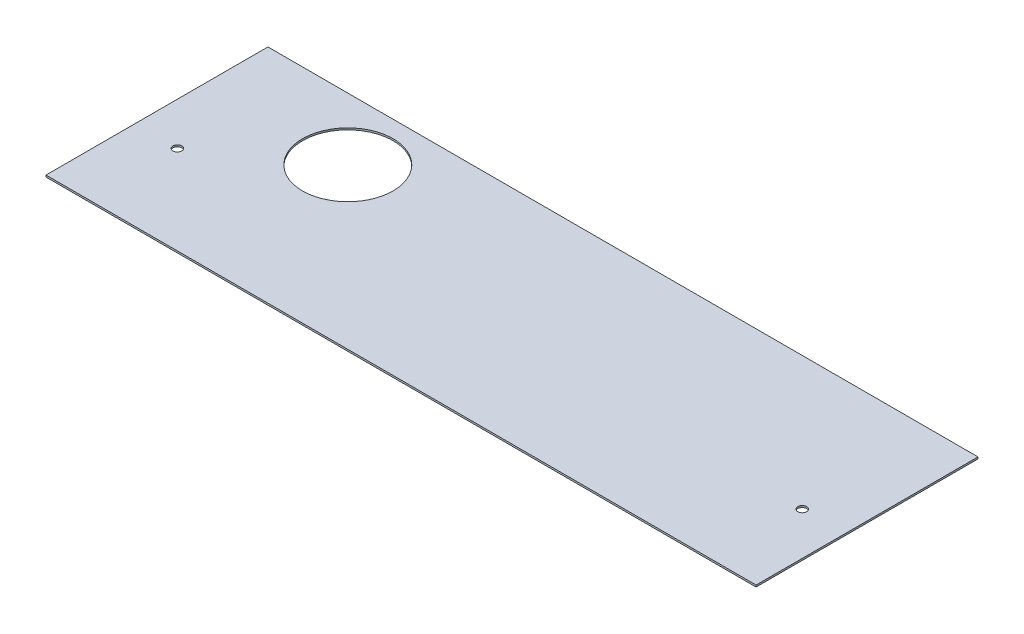
ISO-10303-21;
HEADER;
FILE_DESCRIPTION(('STEP AP214'),'2;1');
FILE_NAME('part.step','',(''),(''),'','','');
FILE_SCHEMA(('AUTOMOTIVE_DESIGN { 1 0 10303 214 1 1 1 1 }'));
ENDSEC;
DATA;
#1=APPLICATION_CONTEXT('core data for automotive mechanical design processes');
#2=APPLICATION_PROTOCOL_DEFINITION('international standard','automotive_design',2000,#1);
#3=PRODUCT_CONTEXT('',#1,'mechanical');
#4=PRODUCT('Part','Part','',(#3));
#5=PRODUCT_RELATED_PRODUCT_CATEGORY('part','',(#4));
#6=PRODUCT_DEFINITION_FORMATION('','',#4);
#7=PRODUCT_DEFINITION_CONTEXT('part definition',#1,'design');
#8=PRODUCT_DEFINITION('design','',#6,#7);
#9=PRODUCT_DEFINITION_SHAPE('','',#8);
#10=(LENGTH_UNIT() NAMED_UNIT(*) SI_UNIT(.MILLI.,.METRE.));
#11=(NAMED_UNIT(*) PLANE_ANGLE_UNIT() SI_UNIT($,.RADIAN.));
#12=(NAMED_UNIT(*) SI_UNIT($,.STERADIAN.) SOLID_ANGLE_UNIT());
#13=UNCERTAINTY_MEASURE_WITH_UNIT(LENGTH_MEASURE(1.E-05),#10,'distance_accuracy_value','');
#14=(GEOMETRIC_REPRESENTATION_CONTEXT(3) GLOBAL_UNCERTAINTY_ASSIGNED_CONTEXT((#13)) GLOBAL_UNIT_ASSIGNED_CONTEXT((#10,
#11,#12)) REPRESENTATION_CONTEXT('',''));
#15=CARTESIAN_POINT('',(0.,0.,0.));
#16=DIRECTION('',(0.,0.,1.));
#17=DIRECTION('',(1.,0.,0.));
#18=AXIS2_PLACEMENT_3D('',#15,#16,#17);
#19=CARTESIAN_POINT('',(0.,-1.,0.));
#20=DIRECTION('',(-1.,0.,0.));
#21=DIRECTION('',(0.,0.,1.));
#22=AXIS2_PLACEMENT_3D('',#19,#20,#21);
#23=PLANE('',#22);
#24=DIRECTION('',(0.,0.,1.));
#25=VECTOR('',#24,1.);
#26=CARTESIAN_POINT('',(0.,0.,0.));
#27=LINE('',#26,#25);
#28=CARTESIAN_POINT('',(0.,0.,-125.));
#29=VERTEX_POINT('',#28);
#30=CARTESIAN_POINT('',(0.,0.,0.));
#31=VERTEX_POINT('',#30);
#32=EDGE_CURVE('E105',#29,#31,#27,.T.);
#33=ORIENTED_EDGE('',*,*,#32,.F.);
#34=DIRECTION('',(0.,1.,0.));
#35=VECTOR('',#34,1.);
#36=CARTESIAN_POINT('',(0.,-1.,-125.));
#37=LINE('',#36,#35);
#38=CARTESIAN_POINT('',(0.,-1.,-125.));
#39=VERTEX_POINT('',#38);
#40=EDGE_CURVE('E11',#39,#29,#37,.T.);
#41=ORIENTED_EDGE('',*,*,#40,.F.);
#42=DIRECTION('',(0.,0.,1.));
#43=VECTOR('',#42,1.);
#44=CARTESIAN_POINT('',(0.,-1.,0.));
#45=LINE('',#44,#43);
#46=CARTESIAN_POINT('',(0.,-1.,0.));
#47=VERTEX_POINT('',#46);
#48=EDGE_CURVE('E98',#39,#47,#45,.T.);
#49=ORIENTED_EDGE('',*,*,#48,.T.);
#50=DIRECTION('',(0.,1.,0.));
#51=VECTOR('',#50,1.);
#52=CARTESIAN_POINT('',(0.,-1.,0.));
#53=LINE('',#52,#51);
#54=EDGE_CURVE('E43',#47,#31,#53,.T.);
#55=ORIENTED_EDGE('',*,*,#54,.T.);
#56=EDGE_LOOP('',(#33,#41,#49,#55));
#57=FACE_BOUND('',#56,.T.);
#58=ADVANCED_FACE('F40',(#57),#23,.T.);
#59=CARTESIAN_POINT('',(0.,-1.,-125.));
#60=DIRECTION('',(0.,0.,-1.));
#61=DIRECTION('',(-1.,0.,0.));
#62=AXIS2_PLACEMENT_3D('',#59,#60,#61);
#63=PLANE('',#62);
#64=DIRECTION('',(-1.,0.,0.));
#65=VECTOR('',#64,1.);
#66=CARTESIAN_POINT('',(0.,0.,-125.));
#67=LINE('',#66,#65);
#68=CARTESIAN_POINT('',(400.,0.,-125.));
#69=VERTEX_POINT('',#68);
#70=EDGE_CURVE('E100',#69,#29,#67,.T.);
#71=ORIENTED_EDGE('',*,*,#70,.F.);
#72=DIRECTION('',(0.,1.,0.));
#73=VECTOR('',#72,1.);
#74=CARTESIAN_POINT('',(400.,-1.,-125.));
#75=LINE('',#74,#73);
#76=CARTESIAN_POINT('',(400.,-1.,-125.));
#77=VERTEX_POINT('',#76);
#78=EDGE_CURVE('E49',#77,#69,#75,.T.);
#79=ORIENTED_EDGE('',*,*,#78,.F.);
#80=DIRECTION('',(-1.,0.,0.));
#81=VECTOR('',#80,1.);
#82=CARTESIAN_POINT('',(0.,-1.,-125.));
#83=LINE('',#82,#81);
#84=EDGE_CURVE('E95',#77,#39,#83,.T.);
#85=ORIENTED_EDGE('',*,*,#84,.T.);
#86=ORIENTED_EDGE('',*,*,#40,.T.);
#87=EDGE_LOOP('',(#71,#79,#85,#86));
#88=FACE_BOUND('',#87,.T.);
#89=ADVANCED_FACE('F116',(#88),#63,.T.);
#90=CARTESIAN_POINT('',(400.,-1.,0.));
#91=DIRECTION('',(1.,0.,0.));
#92=DIRECTION('',(0.,0.,-1.));
#93=AXIS2_PLACEMENT_3D('',#90,#91,#92);
#94=PLANE('',#93);
#95=DIRECTION('',(0.,0.,-1.));
#96=VECTOR('',#95,1.);
#97=CARTESIAN_POINT('',(400.,0.,0.));
#98=LINE('',#97,#96);
#99=CARTESIAN_POINT('',(400.,0.,0.));
#100=VERTEX_POINT('',#99);
#101=EDGE_CURVE('E90',#100,#69,#98,.T.);
#102=ORIENTED_EDGE('',*,*,#101,.F.);
#103=DIRECTION('',(0.,1.,0.));
#104=VECTOR('',#103,1.);
#105=CARTESIAN_POINT('',(400.,-1.,0.));
#106=LINE('',#105,#104);
#107=CARTESIAN_POINT('',(400.,-1.,0.));
#108=VERTEX_POINT('',#107);
#109=EDGE_CURVE('E85',#108,#100,#106,.T.);
#110=ORIENTED_EDGE('',*,*,#109,.F.);
#111=DIRECTION('',(0.,0.,-1.));
#112=VECTOR('',#111,1.);
#113=CARTESIAN_POINT('',(400.,-1.,0.));
#114=LINE('',#113,#112);
#115=EDGE_CURVE('E88',#108,#77,#114,.T.);
#116=ORIENTED_EDGE('',*,*,#115,.T.);
#117=ORIENTED_EDGE('',*,*,#78,.T.);
#118=EDGE_LOOP('',(#102,#110,#116,#117));
#119=FACE_BOUND('',#118,.T.);
#120=ADVANCED_FACE('F87',(#119),#94,.T.);
#121=CARTESIAN_POINT('',(0.,-1.,0.));
#122=DIRECTION('',(0.,0.,1.));
#123=DIRECTION('',(1.,0.,0.));
#124=AXIS2_PLACEMENT_3D('',#121,#122,#123);
#125=PLANE('',#124);
#126=DIRECTION('',(1.,0.,0.));
#127=VECTOR('',#126,1.);
#128=CARTESIAN_POINT('',(0.,0.,0.));
#129=LINE('',#128,#127);
#130=EDGE_CURVE('E108',#31,#100,#129,.T.);
#131=ORIENTED_EDGE('',*,*,#130,.F.);
#132=ORIENTED_EDGE('',*,*,#54,.F.);
#133=DIRECTION('',(1.,0.,0.));
#134=VECTOR('',#133,1.);
#135=CARTESIAN_POINT('',(0.,-1.,0.));
#136=LINE('',#135,#134);
#137=EDGE_CURVE('E94',#47,#108,#136,.T.);
#138=ORIENTED_EDGE('',*,*,#137,.T.);
#139=ORIENTED_EDGE('',*,*,#109,.T.);
#140=EDGE_LOOP('',(#131,#132,#138,#139));
#141=FACE_BOUND('',#140,.T.);
#142=ADVANCED_FACE('F97',(#141),#125,.T.);
#143=CARTESIAN_POINT('',(0.,-1.,0.));
#144=DIRECTION('',(0.,-1.,0.));
#145=DIRECTION('',(0.,0.,-1.));
#146=AXIS2_PLACEMENT_3D('',#143,#144,#145);
#147=PLANE('',#146);
#148=CARTESIAN_POINT('',(80.,-1.,-90.));
#149=DIRECTION('',(0.,1.,0.));
#150=DIRECTION('',(0.,0.,1.));
#151=AXIS2_PLACEMENT_3D('',#148,#149,#150);
#152=CIRCLE('',#151,25.5);
#153=CARTESIAN_POINT('',(80.,-1.,-64.5));
#154=VERTEX_POINT('',#153);
#155=EDGE_CURVE('E154',#154,#154,#152,.T.);
#156=ORIENTED_EDGE('',*,*,#155,.T.);
#157=EDGE_LOOP('',(#156));
#158=FACE_BOUND('',#157,.T.);
#159=CARTESIAN_POINT('',(376.,-1.,-50.));
#160=DIRECTION('',(0.,1.,0.));
#161=DIRECTION('',(0.,0.,-1.));
#162=AXIS2_PLACEMENT_3D('',#159,#160,#161);
#163=CIRCLE('',#162,2.50000000000002);
#164=CARTESIAN_POINT('',(376.,-1.,-52.5));
#165=VERTEX_POINT('',#164);
#166=EDGE_CURVE('E162',#165,#165,#163,.T.);
#167=ORIENTED_EDGE('',*,*,#166,.T.);
#168=EDGE_LOOP('',(#167));
#169=FACE_BOUND('',#168,.T.);
#170=CARTESIAN_POINT('',(24.,-1.,-50.));
#171=DIRECTION('',(0.,1.,0.));
#172=DIRECTION('',(0.,0.,1.));
#173=AXIS2_PLACEMENT_3D('',#170,#171,#172);
#174=CIRCLE('',#173,2.5);
#175=CARTESIAN_POINT('',(24.,-1.,-47.5));
#176=VERTEX_POINT('',#175);
#177=EDGE_CURVE('E109',#176,#176,#174,.T.);
#178=ORIENTED_EDGE('',*,*,#177,.T.);
#179=EDGE_LOOP('',(#178));
#180=FACE_BOUND('',#179,.T.);
#181=ORIENTED_EDGE('',*,*,#48,.F.);
#182=ORIENTED_EDGE('',*,*,#84,.F.);
#183=ORIENTED_EDGE('',*,*,#115,.F.);
#184=ORIENTED_EDGE('',*,*,#137,.F.);
#185=EDGE_LOOP('',(#181,#182,#183,#184));
#186=FACE_BOUND('',#185,.T.);
#187=ADVANCED_FACE('F93',(#158,#169,#180,#186),#147,.T.);
#188=CARTESIAN_POINT('',(0.,0.,0.));
#189=DIRECTION('',(0.,-1.,0.));
#190=DIRECTION('',(0.,0.,-1.));
#191=AXIS2_PLACEMENT_3D('',#188,#189,#190);
#192=PLANE('',#191);
#193=CARTESIAN_POINT('',(80.,0.,-90.));
#194=DIRECTION('',(0.,1.,0.));
#195=DIRECTION('',(0.,0.,1.));
#196=AXIS2_PLACEMENT_3D('',#193,#194,#195);
#197=CIRCLE('',#196,25.5);
#198=CARTESIAN_POINT('',(80.,0.,-64.5));
#199=VERTEX_POINT('',#198);
#200=EDGE_CURVE('E157',#199,#199,#197,.T.);
#201=ORIENTED_EDGE('',*,*,#200,.F.);
#202=EDGE_LOOP('',(#201));
#203=FACE_BOUND('',#202,.T.);
#204=CARTESIAN_POINT('',(376.,0.,-50.));
#205=DIRECTION('',(0.,1.,0.));
#206=DIRECTION('',(0.,0.,-1.));
#207=AXIS2_PLACEMENT_3D('',#204,#205,#206);
#208=CIRCLE('',#207,2.50000000000002);
#209=CARTESIAN_POINT('',(376.,0.,-52.5));
#210=VERTEX_POINT('',#209);
#211=EDGE_CURVE('E159',#210,#210,#208,.T.);
#212=ORIENTED_EDGE('',*,*,#211,.F.);
#213=EDGE_LOOP('',(#212));
#214=FACE_BOUND('',#213,.T.);
#215=CARTESIAN_POINT('',(24.,0.,-50.));
#216=DIRECTION('',(0.,1.,0.));
#217=DIRECTION('',(0.,0.,1.));
#218=AXIS2_PLACEMENT_3D('',#215,#216,#217);
#219=CIRCLE('',#218,2.5);
#220=CARTESIAN_POINT('',(24.,0.,-47.5));
#221=VERTEX_POINT('',#220);
#222=EDGE_CURVE('E165',#221,#221,#219,.T.);
#223=ORIENTED_EDGE('',*,*,#222,.F.);
#224=EDGE_LOOP('',(#223));
#225=FACE_BOUND('',#224,.T.);
#226=ORIENTED_EDGE('',*,*,#32,.T.);
#227=ORIENTED_EDGE('',*,*,#130,.T.);
#228=ORIENTED_EDGE('',*,*,#101,.T.);
#229=ORIENTED_EDGE('',*,*,#70,.T.);
#230=EDGE_LOOP('',(#226,#227,#228,#229));
#231=FACE_BOUND('',#230,.T.);
#232=ADVANCED_FACE('F115',(#203,#214,#225,#231),#192,.F.);
#233=CARTESIAN_POINT('',(24.,-1.,-50.));
#234=DIRECTION('',(0.,1.,0.));
#235=DIRECTION('',(0.,0.,1.));
#236=AXIS2_PLACEMENT_3D('',#233,#234,#235);
#237=CYLINDRICAL_SURFACE('',#236,2.5);
#238=ORIENTED_EDGE('',*,*,#177,.F.);
#239=EDGE_LOOP('',(#238));
#240=FACE_BOUND('',#239,.T.);
#241=ORIENTED_EDGE('',*,*,#222,.T.);
#242=EDGE_LOOP('',(#241));
#243=FACE_BOUND('',#242,.T.);
#244=ADVANCED_FACE('F135',(#240,#243),#237,.F.);
#245=CARTESIAN_POINT('',(376.,-1.,-50.));
#246=DIRECTION('',(0.,1.,0.));
#247=DIRECTION('',(0.,0.,1.));
#248=AXIS2_PLACEMENT_3D('',#245,#246,#247);
#249=CYLINDRICAL_SURFACE('',#248,2.50000000000002);
#250=ORIENTED_EDGE('',*,*,#166,.F.);
#251=EDGE_LOOP('',(#250));
#252=FACE_BOUND('',#251,.T.);
#253=ORIENTED_EDGE('',*,*,#211,.T.);
#254=EDGE_LOOP('',(#253));
#255=FACE_BOUND('',#254,.T.);
#256=ADVANCED_FACE('F142',(#252,#255),#249,.F.);
#257=CARTESIAN_POINT('',(80.,-1.,-90.));
#258=DIRECTION('',(0.,1.,0.));
#259=DIRECTION('',(0.,0.,1.));
#260=AXIS2_PLACEMENT_3D('',#257,#258,#259);
#261=CYLINDRICAL_SURFACE('',#260,25.5);
#262=ORIENTED_EDGE('',*,*,#155,.F.);
#263=EDGE_LOOP('',(#262));
#264=FACE_BOUND('',#263,.T.);
#265=ORIENTED_EDGE('',*,*,#200,.T.);
#266=EDGE_LOOP('',(#265));
#267=FACE_BOUND('',#266,.T.);
#268=ADVANCED_FACE('F146',(#264,#267),#261,.F.);
#269=CLOSED_SHELL('',(#58,#89,#120,#142,#187,#232,#244,#256,#268));
#270=MANIFOLD_SOLID_BREP('B2',#269);
#271=ADVANCED_BREP_SHAPE_REPRESENTATION('',(#18,#270),#14);
#272=SHAPE_DEFINITION_REPRESENTATION(#9,#271);
ENDSEC;
END-ISO-10303-21;
